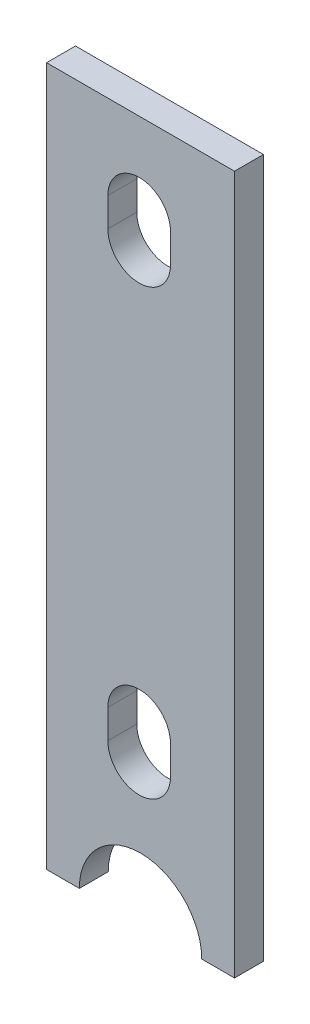
ISO-10303-21;
HEADER;
FILE_DESCRIPTION(('STEP AP214'),'2;1');
FILE_NAME('part.step','',(''),(''),'','','');
FILE_SCHEMA(('AUTOMOTIVE_DESIGN { 1 0 10303 214 1 1 1 1 }'));
ENDSEC;
DATA;
#1=APPLICATION_CONTEXT('core data for automotive mechanical design processes');
#2=APPLICATION_PROTOCOL_DEFINITION('international standard','automotive_design',2000,#1);
#3=PRODUCT_CONTEXT('',#1,'mechanical');
#4=PRODUCT('Part','Part','',(#3));
#5=PRODUCT_RELATED_PRODUCT_CATEGORY('part','',(#4));
#6=PRODUCT_DEFINITION_FORMATION('','',#4);
#7=PRODUCT_DEFINITION_CONTEXT('part definition',#1,'design');
#8=PRODUCT_DEFINITION('design','',#6,#7);
#9=PRODUCT_DEFINITION_SHAPE('','',#8);
#10=(LENGTH_UNIT() NAMED_UNIT(*) SI_UNIT(.MILLI.,.METRE.));
#11=(NAMED_UNIT(*) PLANE_ANGLE_UNIT() SI_UNIT($,.RADIAN.));
#12=(NAMED_UNIT(*) SI_UNIT($,.STERADIAN.) SOLID_ANGLE_UNIT());
#13=UNCERTAINTY_MEASURE_WITH_UNIT(LENGTH_MEASURE(1.E-05),#10,'distance_accuracy_value','');
#14=(GEOMETRIC_REPRESENTATION_CONTEXT(3) GLOBAL_UNCERTAINTY_ASSIGNED_CONTEXT((#13)) GLOBAL_UNIT_ASSIGNED_CONTEXT((#10,
#11,#12)) REPRESENTATION_CONTEXT('',''));
#15=CARTESIAN_POINT('',(0.,0.,0.));
#16=DIRECTION('',(0.,0.,1.));
#17=DIRECTION('',(1.,0.,0.));
#18=AXIS2_PLACEMENT_3D('',#15,#16,#17);
#19=CARTESIAN_POINT('',(0.,-145.,6.));
#20=DIRECTION('',(0.,1.,0.));
#21=DIRECTION('',(0.,0.,1.));
#22=AXIS2_PLACEMENT_3D('',#19,#20,#21);
#23=PLANE('',#22);
#24=DIRECTION('',(1.,0.,0.));
#25=VECTOR('',#24,1.);
#26=CARTESIAN_POINT('',(0.,-145.,0.));
#27=LINE('',#26,#25);
#28=CARTESIAN_POINT('',(0.,-145.,0.));
#29=VERTEX_POINT('',#28);
#30=CARTESIAN_POINT('',(6.80000000000002,-145.,0.));
#31=VERTEX_POINT('',#30);
#32=EDGE_CURVE('E154',#29,#31,#27,.T.);
#33=ORIENTED_EDGE('',*,*,#32,.T.);
#34=DIRECTION('',(0.,0.,1.));
#35=VECTOR('',#34,1.);
#36=CARTESIAN_POINT('',(6.80000000000002,-145.,-4.));
#37=LINE('',#36,#35);
#38=CARTESIAN_POINT('',(6.80000000000002,-145.,6.));
#39=VERTEX_POINT('',#38);
#40=EDGE_CURVE('E58',#31,#39,#37,.T.);
#41=ORIENTED_EDGE('',*,*,#40,.T.);
#42=DIRECTION('',(1.,0.,0.));
#43=VECTOR('',#42,1.);
#44=CARTESIAN_POINT('',(0.,-145.,6.));
#45=LINE('',#44,#43);
#46=CARTESIAN_POINT('',(0.,-145.,6.));
#47=VERTEX_POINT('',#46);
#48=EDGE_CURVE('E152',#47,#39,#45,.T.);
#49=ORIENTED_EDGE('',*,*,#48,.F.);
#50=DIRECTION('',(0.,0.,-1.));
#51=VECTOR('',#50,1.);
#52=CARTESIAN_POINT('',(0.,-145.,6.));
#53=LINE('',#52,#51);
#54=EDGE_CURVE('E51',#47,#29,#53,.T.);
#55=ORIENTED_EDGE('',*,*,#54,.T.);
#56=EDGE_LOOP('',(#33,#41,#49,#55));
#57=FACE_BOUND('',#56,.T.);
#58=ADVANCED_FACE('F43',(#57),#23,.F.);
#59=CARTESIAN_POINT('',(0.,0.,6.));
#60=DIRECTION('',(1.,0.,0.));
#61=DIRECTION('',(0.,1.,0.));
#62=AXIS2_PLACEMENT_3D('',#59,#60,#61);
#63=PLANE('',#62);
#64=DIRECTION('',(0.,-1.,0.));
#65=VECTOR('',#64,1.);
#66=CARTESIAN_POINT('',(0.,0.,0.));
#67=LINE('',#66,#65);
#68=CARTESIAN_POINT('',(0.,0.,0.));
#69=VERTEX_POINT('',#68);
#70=EDGE_CURVE('E171',#69,#29,#67,.T.);
#71=ORIENTED_EDGE('',*,*,#70,.T.);
#72=ORIENTED_EDGE('',*,*,#54,.F.);
#73=DIRECTION('',(0.,-1.,0.));
#74=VECTOR('',#73,1.);
#75=CARTESIAN_POINT('',(0.,0.,6.));
#76=LINE('',#75,#74);
#77=CARTESIAN_POINT('',(0.,0.,6.));
#78=VERTEX_POINT('',#77);
#79=EDGE_CURVE('E159',#78,#47,#76,.T.);
#80=ORIENTED_EDGE('',*,*,#79,.F.);
#81=DIRECTION('',(0.,0.,-1.));
#82=VECTOR('',#81,1.);
#83=CARTESIAN_POINT('',(0.,0.,6.));
#84=LINE('',#83,#82);
#85=EDGE_CURVE('E170',#78,#69,#84,.T.);
#86=ORIENTED_EDGE('',*,*,#85,.T.);
#87=EDGE_LOOP('',(#71,#72,#80,#86));
#88=FACE_BOUND('',#87,.T.);
#89=ADVANCED_FACE('F45',(#88),#63,.F.);
#90=CARTESIAN_POINT('',(32.2,-145.,6.));
#91=VERTEX_POINT('',#90);
#92=CARTESIAN_POINT('',(39.,-145.,6.));
#93=VERTEX_POINT('',#92);
#94=EDGE_CURVE('E162',#91,#93,#45,.T.);
#95=ORIENTED_EDGE('',*,*,#94,.F.);
#96=DIRECTION('',(0.,0.,1.));
#97=VECTOR('',#96,1.);
#98=CARTESIAN_POINT('',(32.2,-145.,-4.));
#99=LINE('',#98,#97);
#100=CARTESIAN_POINT('',(32.2,-145.,0.));
#101=VERTEX_POINT('',#100);
#102=EDGE_CURVE('E144',#101,#91,#99,.T.);
#103=ORIENTED_EDGE('',*,*,#102,.F.);
#104=CARTESIAN_POINT('',(39.,-145.,0.));
#105=VERTEX_POINT('',#104);
#106=EDGE_CURVE('E174',#101,#105,#27,.T.);
#107=ORIENTED_EDGE('',*,*,#106,.T.);
#108=DIRECTION('',(0.,0.,-1.));
#109=VECTOR('',#108,1.);
#110=CARTESIAN_POINT('',(39.,-145.,6.));
#111=LINE('',#110,#109);
#112=EDGE_CURVE('E186',#93,#105,#111,.T.);
#113=ORIENTED_EDGE('',*,*,#112,.F.);
#114=EDGE_LOOP('',(#95,#103,#107,#113));
#115=FACE_BOUND('',#114,.T.);
#116=ADVANCED_FACE('F197',(#115),#23,.F.);
#117=CARTESIAN_POINT('',(39.,0.,6.));
#118=DIRECTION('',(-1.,0.,0.));
#119=DIRECTION('',(0.,-1.,0.));
#120=AXIS2_PLACEMENT_3D('',#117,#118,#119);
#121=PLANE('',#120);
#122=DIRECTION('',(0.,1.,0.));
#123=VECTOR('',#122,1.);
#124=CARTESIAN_POINT('',(39.,0.,0.));
#125=LINE('',#124,#123);
#126=CARTESIAN_POINT('',(39.,0.,0.));
#127=VERTEX_POINT('',#126);
#128=EDGE_CURVE('E177',#105,#127,#125,.T.);
#129=ORIENTED_EDGE('',*,*,#128,.T.);
#130=DIRECTION('',(0.,0.,-1.));
#131=VECTOR('',#130,1.);
#132=CARTESIAN_POINT('',(39.,0.,6.));
#133=LINE('',#132,#131);
#134=CARTESIAN_POINT('',(39.,0.,6.));
#135=VERTEX_POINT('',#134);
#136=EDGE_CURVE('E183',#135,#127,#133,.T.);
#137=ORIENTED_EDGE('',*,*,#136,.F.);
#138=DIRECTION('',(0.,1.,0.));
#139=VECTOR('',#138,1.);
#140=CARTESIAN_POINT('',(39.,0.,6.));
#141=LINE('',#140,#139);
#142=EDGE_CURVE('E161',#93,#135,#141,.T.);
#143=ORIENTED_EDGE('',*,*,#142,.F.);
#144=ORIENTED_EDGE('',*,*,#112,.T.);
#145=EDGE_LOOP('',(#129,#137,#143,#144));
#146=FACE_BOUND('',#145,.T.);
#147=ADVANCED_FACE('F288',(#146),#121,.F.);
#148=CARTESIAN_POINT('',(0.,0.,6.));
#149=DIRECTION('',(0.,-1.,0.));
#150=DIRECTION('',(0.,0.,-1.));
#151=AXIS2_PLACEMENT_3D('',#148,#149,#150);
#152=PLANE('',#151);
#153=DIRECTION('',(-1.,0.,0.));
#154=VECTOR('',#153,1.);
#155=CARTESIAN_POINT('',(0.,0.,0.));
#156=LINE('',#155,#154);
#157=EDGE_CURVE('E179',#127,#69,#156,.T.);
#158=ORIENTED_EDGE('',*,*,#157,.T.);
#159=ORIENTED_EDGE('',*,*,#85,.F.);
#160=DIRECTION('',(-1.,0.,0.));
#161=VECTOR('',#160,1.);
#162=CARTESIAN_POINT('',(0.,0.,6.));
#163=LINE('',#162,#161);
#164=EDGE_CURVE('E164',#135,#78,#163,.T.);
#165=ORIENTED_EDGE('',*,*,#164,.F.);
#166=ORIENTED_EDGE('',*,*,#136,.T.);
#167=EDGE_LOOP('',(#158,#159,#165,#166));
#168=FACE_BOUND('',#167,.T.);
#169=ADVANCED_FACE('F279',(#168),#152,.F.);
#170=CARTESIAN_POINT('',(0.,0.,6.));
#171=DIRECTION('',(0.,0.,1.));
#172=DIRECTION('',(1.,0.,0.));
#173=AXIS2_PLACEMENT_3D('',#170,#171,#172);
#174=PLANE('',#173);
#175=CARTESIAN_POINT('',(19.5,-145.,6.));
#176=DIRECTION('',(0.,0.,1.));
#177=DIRECTION('',(-1.,0.,0.));
#178=AXIS2_PLACEMENT_3D('',#175,#176,#177);
#179=CIRCLE('',#178,12.7);
#180=EDGE_CURVE('E141',#91,#39,#179,.T.);
#181=ORIENTED_EDGE('',*,*,#180,.F.);
#182=ORIENTED_EDGE('',*,*,#94,.T.);
#183=ORIENTED_EDGE('',*,*,#142,.T.);
#184=ORIENTED_EDGE('',*,*,#164,.T.);
#185=ORIENTED_EDGE('',*,*,#79,.T.);
#186=ORIENTED_EDGE('',*,*,#48,.T.);
#187=EDGE_LOOP('',(#181,#182,#183,#184,#185,#186));
#188=FACE_BOUND('',#187,.T.);
#189=CARTESIAN_POINT('',(19.2172600014123,-109.5,6.));
#190=DIRECTION('',(0.,0.,1.));
#191=DIRECTION('',(1.,0.,0.));
#192=AXIS2_PLACEMENT_3D('',#189,#190,#191);
#193=CIRCLE('',#192,6.50000000000001);
#194=CARTESIAN_POINT('',(25.7172600014123,-109.5,6.));
#195=VERTEX_POINT('',#194);
#196=CARTESIAN_POINT('',(12.7172600014123,-109.5,6.));
#197=VERTEX_POINT('',#196);
#198=EDGE_CURVE('E65',#195,#197,#193,.T.);
#199=ORIENTED_EDGE('',*,*,#198,.F.);
#200=DIRECTION('',(0.,1.,0.));
#201=VECTOR('',#200,1.);
#202=CARTESIAN_POINT('',(25.7172600014123,-109.5,6.));
#203=LINE('',#202,#201);
#204=CARTESIAN_POINT('',(25.7172600014123,-115.5,6.));
#205=VERTEX_POINT('',#204);
#206=EDGE_CURVE('E208',#205,#195,#203,.T.);
#207=ORIENTED_EDGE('',*,*,#206,.F.);
#208=CARTESIAN_POINT('',(19.2172600014123,-115.5,6.));
#209=DIRECTION('',(0.,0.,1.));
#210=DIRECTION('',(1.,0.,0.));
#211=AXIS2_PLACEMENT_3D('',#208,#209,#210);
#212=CIRCLE('',#211,6.50000000000001);
#213=CARTESIAN_POINT('',(12.7172600014123,-115.5,6.));
#214=VERTEX_POINT('',#213);
#215=EDGE_CURVE('E223',#214,#205,#212,.T.);
#216=ORIENTED_EDGE('',*,*,#215,.F.);
#217=DIRECTION('',(0.,-1.,0.));
#218=VECTOR('',#217,1.);
#219=CARTESIAN_POINT('',(12.7172600014123,-109.5,6.));
#220=LINE('',#219,#218);
#221=EDGE_CURVE('E219',#197,#214,#220,.T.);
#222=ORIENTED_EDGE('',*,*,#221,.F.);
#223=EDGE_LOOP('',(#199,#207,#216,#222));
#224=FACE_BOUND('',#223,.T.);
#225=CARTESIAN_POINT('',(19.2172600014123,-23.5,6.));
#226=DIRECTION('',(0.,0.,1.));
#227=DIRECTION('',(-1.,0.,0.));
#228=AXIS2_PLACEMENT_3D('',#225,#226,#227);
#229=CIRCLE('',#228,6.50000000000001);
#230=CARTESIAN_POINT('',(12.7172600014123,-23.5,6.));
#231=VERTEX_POINT('',#230);
#232=CARTESIAN_POINT('',(25.7172600014123,-23.5,6.));
#233=VERTEX_POINT('',#232);
#234=EDGE_CURVE('E220',#231,#233,#229,.T.);
#235=ORIENTED_EDGE('',*,*,#234,.F.);
#236=DIRECTION('',(0.,-1.,0.));
#237=VECTOR('',#236,1.);
#238=CARTESIAN_POINT('',(12.7172600014123,-23.5,6.));
#239=LINE('',#238,#237);
#240=CARTESIAN_POINT('',(12.7172600014123,-17.5,6.));
#241=VERTEX_POINT('',#240);
#242=EDGE_CURVE('E241',#241,#231,#239,.T.);
#243=ORIENTED_EDGE('',*,*,#242,.F.);
#244=CARTESIAN_POINT('',(19.2172600014123,-17.5,6.));
#245=DIRECTION('',(0.,0.,1.));
#246=DIRECTION('',(-1.,0.,0.));
#247=AXIS2_PLACEMENT_3D('',#244,#245,#246);
#248=CIRCLE('',#247,6.50000000000001);
#249=CARTESIAN_POINT('',(25.7172600014123,-17.5,6.));
#250=VERTEX_POINT('',#249);
#251=EDGE_CURVE('E244',#250,#241,#248,.T.);
#252=ORIENTED_EDGE('',*,*,#251,.F.);
#253=DIRECTION('',(0.,1.,0.));
#254=VECTOR('',#253,1.);
#255=CARTESIAN_POINT('',(25.7172600014123,-23.5,6.));
#256=LINE('',#255,#254);
#257=EDGE_CURVE('E248',#233,#250,#256,.T.);
#258=ORIENTED_EDGE('',*,*,#257,.F.);
#259=EDGE_LOOP('',(#235,#243,#252,#258));
#260=FACE_BOUND('',#259,.T.);
#261=ADVANCED_FACE('F156',(#188,#224,#260),#174,.T.);
#262=CARTESIAN_POINT('',(0.,0.,0.));
#263=DIRECTION('',(0.,0.,1.));
#264=DIRECTION('',(1.,0.,0.));
#265=AXIS2_PLACEMENT_3D('',#262,#263,#264);
#266=PLANE('',#265);
#267=DIRECTION('',(0.,1.,0.));
#268=VECTOR('',#267,1.);
#269=CARTESIAN_POINT('',(25.7172600014123,-109.5,0.));
#270=LINE('',#269,#268);
#271=CARTESIAN_POINT('',(25.7172600014123,-115.5,0.));
#272=VERTEX_POINT('',#271);
#273=CARTESIAN_POINT('',(25.7172600014123,-109.5,0.));
#274=VERTEX_POINT('',#273);
#275=EDGE_CURVE('E214',#272,#274,#270,.T.);
#276=ORIENTED_EDGE('',*,*,#275,.T.);
#277=CARTESIAN_POINT('',(19.2172600014123,-109.5,0.));
#278=DIRECTION('',(0.,0.,1.));
#279=DIRECTION('',(1.,0.,0.));
#280=AXIS2_PLACEMENT_3D('',#277,#278,#279);
#281=CIRCLE('',#280,6.50000000000001);
#282=CARTESIAN_POINT('',(12.7172600014123,-109.5,0.));
#283=VERTEX_POINT('',#282);
#284=EDGE_CURVE('E204',#274,#283,#281,.T.);
#285=ORIENTED_EDGE('',*,*,#284,.T.);
#286=DIRECTION('',(0.,-1.,0.));
#287=VECTOR('',#286,1.);
#288=CARTESIAN_POINT('',(12.7172600014123,-109.5,0.));
#289=LINE('',#288,#287);
#290=CARTESIAN_POINT('',(12.7172600014123,-115.5,0.));
#291=VERTEX_POINT('',#290);
#292=EDGE_CURVE('E207',#283,#291,#289,.T.);
#293=ORIENTED_EDGE('',*,*,#292,.T.);
#294=CARTESIAN_POINT('',(19.2172600014123,-115.5,0.));
#295=DIRECTION('',(0.,0.,1.));
#296=DIRECTION('',(1.,0.,0.));
#297=AXIS2_PLACEMENT_3D('',#294,#295,#296);
#298=CIRCLE('',#297,6.50000000000001);
#299=EDGE_CURVE('E211',#291,#272,#298,.T.);
#300=ORIENTED_EDGE('',*,*,#299,.T.);
#301=EDGE_LOOP('',(#276,#285,#293,#300));
#302=FACE_BOUND('',#301,.T.);
#303=DIRECTION('',(0.,-1.,0.));
#304=VECTOR('',#303,1.);
#305=CARTESIAN_POINT('',(12.7172600014123,-23.5,0.));
#306=LINE('',#305,#304);
#307=CARTESIAN_POINT('',(12.7172600014123,-17.5,0.));
#308=VERTEX_POINT('',#307);
#309=CARTESIAN_POINT('',(12.7172600014123,-23.5,0.));
#310=VERTEX_POINT('',#309);
#311=EDGE_CURVE('E237',#308,#310,#306,.T.);
#312=ORIENTED_EDGE('',*,*,#311,.T.);
#313=CARTESIAN_POINT('',(19.2172600014123,-23.5,0.));
#314=DIRECTION('',(0.,0.,1.));
#315=DIRECTION('',(-1.,0.,0.));
#316=AXIS2_PLACEMENT_3D('',#313,#314,#315);
#317=CIRCLE('',#316,6.50000000000001);
#318=CARTESIAN_POINT('',(25.7172600014123,-23.5,0.));
#319=VERTEX_POINT('',#318);
#320=EDGE_CURVE('E245',#310,#319,#317,.T.);
#321=ORIENTED_EDGE('',*,*,#320,.T.);
#322=DIRECTION('',(0.,1.,0.));
#323=VECTOR('',#322,1.);
#324=CARTESIAN_POINT('',(25.7172600014123,-23.5,0.));
#325=LINE('',#324,#323);
#326=CARTESIAN_POINT('',(25.7172600014123,-17.5,0.));
#327=VERTEX_POINT('',#326);
#328=EDGE_CURVE('E257',#319,#327,#325,.T.);
#329=ORIENTED_EDGE('',*,*,#328,.T.);
#330=CARTESIAN_POINT('',(19.2172600014123,-17.5,0.));
#331=DIRECTION('',(0.,0.,1.));
#332=DIRECTION('',(-1.,0.,0.));
#333=AXIS2_PLACEMENT_3D('',#330,#331,#332);
#334=CIRCLE('',#333,6.50000000000001);
#335=EDGE_CURVE('E254',#327,#308,#334,.T.);
#336=ORIENTED_EDGE('',*,*,#335,.T.);
#337=EDGE_LOOP('',(#312,#321,#329,#336));
#338=FACE_BOUND('',#337,.T.);
#339=ORIENTED_EDGE('',*,*,#106,.F.);
#340=CARTESIAN_POINT('',(19.5,-145.,0.));
#341=DIRECTION('',(0.,0.,1.));
#342=DIRECTION('',(1.,0.,0.));
#343=AXIS2_PLACEMENT_3D('',#340,#341,#342);
#344=CIRCLE('',#343,12.7);
#345=EDGE_CURVE('E11',#101,#31,#344,.T.);
#346=ORIENTED_EDGE('',*,*,#345,.T.);
#347=ORIENTED_EDGE('',*,*,#32,.F.);
#348=ORIENTED_EDGE('',*,*,#70,.F.);
#349=ORIENTED_EDGE('',*,*,#157,.F.);
#350=ORIENTED_EDGE('',*,*,#128,.F.);
#351=EDGE_LOOP('',(#339,#346,#347,#348,#349,#350));
#352=FACE_BOUND('',#351,.T.);
#353=ADVANCED_FACE('F194',(#302,#338,#352),#266,.F.);
#354=CARTESIAN_POINT('',(19.2172600014123,-23.5,0.));
#355=DIRECTION('',(0.,0.,1.));
#356=DIRECTION('',(1.,0.,0.));
#357=AXIS2_PLACEMENT_3D('',#354,#355,#356);
#358=CYLINDRICAL_SURFACE('',#357,6.50000000000001);
#359=ORIENTED_EDGE('',*,*,#234,.T.);
#360=DIRECTION('',(0.,0.,1.));
#361=VECTOR('',#360,1.);
#362=CARTESIAN_POINT('',(25.7172600014123,-23.5,0.));
#363=LINE('',#362,#361);
#364=EDGE_CURVE('E234',#319,#233,#363,.T.);
#365=ORIENTED_EDGE('',*,*,#364,.F.);
#366=ORIENTED_EDGE('',*,*,#320,.F.);
#367=DIRECTION('',(0.,0.,1.));
#368=VECTOR('',#367,1.);
#369=CARTESIAN_POINT('',(12.7172600014123,-23.5,0.));
#370=LINE('',#369,#368);
#371=EDGE_CURVE('E199',#310,#231,#370,.T.);
#372=ORIENTED_EDGE('',*,*,#371,.T.);
#373=EDGE_LOOP('',(#359,#365,#366,#372));
#374=FACE_BOUND('',#373,.T.);
#375=ADVANCED_FACE('F265',(#374),#358,.F.);
#376=CARTESIAN_POINT('',(12.7172600014123,-23.5,0.));
#377=DIRECTION('',(-1.,0.,0.));
#378=DIRECTION('',(0.,0.,1.));
#379=AXIS2_PLACEMENT_3D('',#376,#377,#378);
#380=PLANE('',#379);
#381=ORIENTED_EDGE('',*,*,#242,.T.);
#382=ORIENTED_EDGE('',*,*,#371,.F.);
#383=ORIENTED_EDGE('',*,*,#311,.F.);
#384=DIRECTION('',(0.,0.,1.));
#385=VECTOR('',#384,1.);
#386=CARTESIAN_POINT('',(12.7172600014123,-17.5,0.));
#387=LINE('',#386,#385);
#388=EDGE_CURVE('E201',#308,#241,#387,.T.);
#389=ORIENTED_EDGE('',*,*,#388,.T.);
#390=EDGE_LOOP('',(#381,#382,#383,#389));
#391=FACE_BOUND('',#390,.T.);
#392=ADVANCED_FACE('F276',(#391),#380,.F.);
#393=CARTESIAN_POINT('',(19.2172600014123,-17.5,0.));
#394=DIRECTION('',(0.,0.,1.));
#395=DIRECTION('',(1.,0.,0.));
#396=AXIS2_PLACEMENT_3D('',#393,#394,#395);
#397=CYLINDRICAL_SURFACE('',#396,6.50000000000001);
#398=ORIENTED_EDGE('',*,*,#251,.T.);
#399=ORIENTED_EDGE('',*,*,#388,.F.);
#400=ORIENTED_EDGE('',*,*,#335,.F.);
#401=DIRECTION('',(0.,0.,1.));
#402=VECTOR('',#401,1.);
#403=CARTESIAN_POINT('',(25.7172600014123,-17.5,0.));
#404=LINE('',#403,#402);
#405=EDGE_CURVE('E238',#327,#250,#404,.T.);
#406=ORIENTED_EDGE('',*,*,#405,.T.);
#407=EDGE_LOOP('',(#398,#399,#400,#406));
#408=FACE_BOUND('',#407,.T.);
#409=ADVANCED_FACE('F273',(#408),#397,.F.);
#410=CARTESIAN_POINT('',(25.7172600014123,-23.5,0.));
#411=DIRECTION('',(1.,0.,0.));
#412=DIRECTION('',(0.,0.,-1.));
#413=AXIS2_PLACEMENT_3D('',#410,#411,#412);
#414=PLANE('',#413);
#415=ORIENTED_EDGE('',*,*,#257,.T.);
#416=ORIENTED_EDGE('',*,*,#405,.F.);
#417=ORIENTED_EDGE('',*,*,#328,.F.);
#418=ORIENTED_EDGE('',*,*,#364,.T.);
#419=EDGE_LOOP('',(#415,#416,#417,#418));
#420=FACE_BOUND('',#419,.T.);
#421=ADVANCED_FACE('F270',(#420),#414,.F.);
#422=CARTESIAN_POINT('',(19.2172600014123,-109.5,0.));
#423=DIRECTION('',(0.,0.,1.));
#424=DIRECTION('',(1.,0.,0.));
#425=AXIS2_PLACEMENT_3D('',#422,#423,#424);
#426=CYLINDRICAL_SURFACE('',#425,6.50000000000001);
#427=ORIENTED_EDGE('',*,*,#198,.T.);
#428=DIRECTION('',(0.,0.,1.));
#429=VECTOR('',#428,1.);
#430=CARTESIAN_POINT('',(12.7172600014123,-109.5,0.));
#431=LINE('',#430,#429);
#432=EDGE_CURVE('E217',#283,#197,#431,.T.);
#433=ORIENTED_EDGE('',*,*,#432,.F.);
#434=ORIENTED_EDGE('',*,*,#284,.F.);
#435=DIRECTION('',(0.,0.,1.));
#436=VECTOR('',#435,1.);
#437=CARTESIAN_POINT('',(25.7172600014123,-109.5,0.));
#438=LINE('',#437,#436);
#439=EDGE_CURVE('E175',#274,#195,#438,.T.);
#440=ORIENTED_EDGE('',*,*,#439,.T.);
#441=EDGE_LOOP('',(#427,#433,#434,#440));
#442=FACE_BOUND('',#441,.T.);
#443=ADVANCED_FACE('F342',(#442),#426,.F.);
#444=CARTESIAN_POINT('',(25.7172600014123,-109.5,0.));
#445=DIRECTION('',(1.,0.,0.));
#446=DIRECTION('',(0.,0.,-1.));
#447=AXIS2_PLACEMENT_3D('',#444,#445,#446);
#448=PLANE('',#447);
#449=ORIENTED_EDGE('',*,*,#206,.T.);
#450=ORIENTED_EDGE('',*,*,#439,.F.);
#451=ORIENTED_EDGE('',*,*,#275,.F.);
#452=DIRECTION('',(0.,0.,1.));
#453=VECTOR('',#452,1.);
#454=CARTESIAN_POINT('',(25.7172600014123,-115.5,0.));
#455=LINE('',#454,#453);
#456=EDGE_CURVE('E229',#272,#205,#455,.T.);
#457=ORIENTED_EDGE('',*,*,#456,.T.);
#458=EDGE_LOOP('',(#449,#450,#451,#457));
#459=FACE_BOUND('',#458,.T.);
#460=ADVANCED_FACE('F350',(#459),#448,.F.);
#461=CARTESIAN_POINT('',(19.2172600014123,-115.5,0.));
#462=DIRECTION('',(0.,0.,1.));
#463=DIRECTION('',(1.,0.,0.));
#464=AXIS2_PLACEMENT_3D('',#461,#462,#463);
#465=CYLINDRICAL_SURFACE('',#464,6.50000000000001);
#466=ORIENTED_EDGE('',*,*,#215,.T.);
#467=ORIENTED_EDGE('',*,*,#456,.F.);
#468=ORIENTED_EDGE('',*,*,#299,.F.);
#469=DIRECTION('',(0.,0.,1.));
#470=VECTOR('',#469,1.);
#471=CARTESIAN_POINT('',(12.7172600014123,-115.5,0.));
#472=LINE('',#471,#470);
#473=EDGE_CURVE('E231',#291,#214,#472,.T.);
#474=ORIENTED_EDGE('',*,*,#473,.T.);
#475=EDGE_LOOP('',(#466,#467,#468,#474));
#476=FACE_BOUND('',#475,.T.);
#477=ADVANCED_FACE('F358',(#476),#465,.F.);
#478=CARTESIAN_POINT('',(12.7172600014123,-109.5,0.));
#479=DIRECTION('',(-1.,0.,0.));
#480=DIRECTION('',(0.,-1.,0.));
#481=AXIS2_PLACEMENT_3D('',#478,#479,#480);
#482=PLANE('',#481);
#483=ORIENTED_EDGE('',*,*,#221,.T.);
#484=ORIENTED_EDGE('',*,*,#473,.F.);
#485=ORIENTED_EDGE('',*,*,#292,.F.);
#486=ORIENTED_EDGE('',*,*,#432,.T.);
#487=EDGE_LOOP('',(#483,#484,#485,#486));
#488=FACE_BOUND('',#487,.T.);
#489=ADVANCED_FACE('F366',(#488),#482,.F.);
#490=CARTESIAN_POINT('',(19.5,-145.,-4.));
#491=DIRECTION('',(0.,0.,1.));
#492=DIRECTION('',(1.,0.,0.));
#493=AXIS2_PLACEMENT_3D('',#490,#491,#492);
#494=CYLINDRICAL_SURFACE('',#493,12.7);
#495=ORIENTED_EDGE('',*,*,#102,.T.);
#496=ORIENTED_EDGE('',*,*,#180,.T.);
#497=ORIENTED_EDGE('',*,*,#40,.F.);
#498=ORIENTED_EDGE('',*,*,#345,.F.);
#499=EDGE_LOOP('',(#495,#496,#497,#498));
#500=FACE_BOUND('',#499,.T.);
#501=ADVANCED_FACE('F142',(#500),#494,.F.);
#502=CLOSED_SHELL('',(#58,#89,#116,#147,#169,#261,#353,#375,#392,#409,#421,#443,#460,#477,#489,#501));
#503=MANIFOLD_SOLID_BREP('B2',#502);
#504=ADVANCED_BREP_SHAPE_REPRESENTATION('',(#18,#503),#14);
#505=SHAPE_DEFINITION_REPRESENTATION(#9,#504);
ENDSEC;
END-ISO-10303-21;
